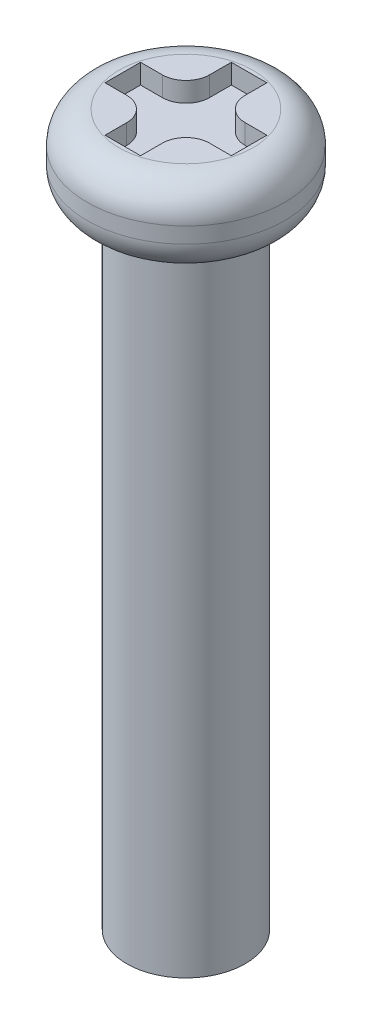
ISO-10303-21;
HEADER;
FILE_DESCRIPTION(('STEP AP214'),'2;1');
FILE_NAME('part.step','',(''),(''),'','','');
FILE_SCHEMA(('AUTOMOTIVE_DESIGN { 1 0 10303 214 1 1 1 1 }'));
ENDSEC;
DATA;
#1=APPLICATION_CONTEXT('core data for automotive mechanical design processes');
#2=APPLICATION_PROTOCOL_DEFINITION('international standard','automotive_design',2000,#1);
#3=PRODUCT_CONTEXT('',#1,'mechanical');
#4=PRODUCT('Part','Part','',(#3));
#5=PRODUCT_RELATED_PRODUCT_CATEGORY('part','',(#4));
#6=PRODUCT_DEFINITION_FORMATION('','',#4);
#7=PRODUCT_DEFINITION_CONTEXT('part definition',#1,'design');
#8=PRODUCT_DEFINITION('design','',#6,#7);
#9=PRODUCT_DEFINITION_SHAPE('','',#8);
#10=(LENGTH_UNIT() NAMED_UNIT(*) SI_UNIT(.MILLI.,.METRE.));
#11=(NAMED_UNIT(*) PLANE_ANGLE_UNIT() SI_UNIT($,.RADIAN.));
#12=(NAMED_UNIT(*) SI_UNIT($,.STERADIAN.) SOLID_ANGLE_UNIT());
#13=UNCERTAINTY_MEASURE_WITH_UNIT(LENGTH_MEASURE(1.E-05),#10,'distance_accuracy_value','');
#14=(GEOMETRIC_REPRESENTATION_CONTEXT(3) GLOBAL_UNCERTAINTY_ASSIGNED_CONTEXT((#13)) GLOBAL_UNIT_ASSIGNED_CONTEXT((#10,
#11,#12)) REPRESENTATION_CONTEXT('',''));
#15=CARTESIAN_POINT('',(0.,0.,0.));
#16=DIRECTION('',(0.,0.,1.));
#17=DIRECTION('',(1.,0.,0.));
#18=AXIS2_PLACEMENT_3D('',#15,#16,#17);
#19=CARTESIAN_POINT('',(0.,2.,0.));
#20=DIRECTION('',(0.,-1.,0.));
#21=DIRECTION('',(0.,0.,-1.));
#22=AXIS2_PLACEMENT_3D('',#19,#20,#21);
#23=PLANE('',#22);
#24=CARTESIAN_POINT('',(0.,2.,0.));
#25=DIRECTION('',(0.,-1.,0.));
#26=DIRECTION('',(0.,0.,-1.));
#27=AXIS2_PLACEMENT_3D('',#24,#25,#26);
#28=CIRCLE('',#27,1.7);
#29=CARTESIAN_POINT('',(0.,2.,-1.7));
#30=VERTEX_POINT('',#29);
#31=EDGE_CURVE('E251',#30,#30,#28,.F.);
#32=ORIENTED_EDGE('',*,*,#31,.T.);
#33=EDGE_LOOP('',(#32));
#34=FACE_BOUND('',#33,.T.);
#35=DIRECTION('',(1.,0.,0.));
#36=VECTOR('',#35,1.);
#37=CARTESIAN_POINT('',(-1.6,2.,0.450000000000001));
#38=LINE('',#37,#36);
#39=CARTESIAN_POINT('',(1.05,2.,0.450000000000001));
#40=VERTEX_POINT('',#39);
#41=CARTESIAN_POINT('',(1.6,2.,0.450000000000001));
#42=VERTEX_POINT('',#41);
#43=EDGE_CURVE('E180',#40,#42,#38,.T.);
#44=ORIENTED_EDGE('',*,*,#43,.F.);
#45=CARTESIAN_POINT('',(1.05,2.,1.05));
#46=DIRECTION('',(0.,-1.,0.));
#47=DIRECTION('',(0.,0.,-1.));
#48=AXIS2_PLACEMENT_3D('',#45,#46,#47);
#49=CIRCLE('',#48,0.6);
#50=CARTESIAN_POINT('',(0.45,2.,1.05));
#51=VERTEX_POINT('',#50);
#52=EDGE_CURVE('E262',#40,#51,#49,.F.);
#53=ORIENTED_EDGE('',*,*,#52,.T.);
#54=DIRECTION('',(0.,0.,-1.));
#55=VECTOR('',#54,1.);
#56=CARTESIAN_POINT('',(0.45,2.,1.6));
#57=LINE('',#56,#55);
#58=CARTESIAN_POINT('',(0.45,2.,1.6));
#59=VERTEX_POINT('',#58);
#60=EDGE_CURVE('E207',#59,#51,#57,.T.);
#61=ORIENTED_EDGE('',*,*,#60,.F.);
#62=DIRECTION('',(-1.,0.,0.));
#63=VECTOR('',#62,1.);
#64=CARTESIAN_POINT('',(0.45,2.,1.6));
#65=LINE('',#64,#63);
#66=CARTESIAN_POINT('',(-0.45,2.,1.6));
#67=VERTEX_POINT('',#66);
#68=EDGE_CURVE('E172',#59,#67,#65,.T.);
#69=ORIENTED_EDGE('',*,*,#68,.T.);
#70=DIRECTION('',(0.,0.,-1.));
#71=VECTOR('',#70,1.);
#72=CARTESIAN_POINT('',(-0.45,2.,1.6));
#73=LINE('',#72,#71);
#74=CARTESIAN_POINT('',(-0.45,2.,1.05));
#75=VERTEX_POINT('',#74);
#76=EDGE_CURVE('E222',#67,#75,#73,.T.);
#77=ORIENTED_EDGE('',*,*,#76,.T.);
#78=CARTESIAN_POINT('',(-1.05,2.,1.05));
#79=DIRECTION('',(0.,-1.,0.));
#80=DIRECTION('',(0.,0.,-1.));
#81=AXIS2_PLACEMENT_3D('',#78,#79,#80);
#82=CIRCLE('',#81,0.6);
#83=CARTESIAN_POINT('',(-1.05,2.,0.450000000000001));
#84=VERTEX_POINT('',#83);
#85=EDGE_CURVE('E260',#75,#84,#82,.F.);
#86=ORIENTED_EDGE('',*,*,#85,.T.);
#87=CARTESIAN_POINT('',(-1.6,2.,0.450000000000001));
#88=VERTEX_POINT('',#87);
#89=EDGE_CURVE('E184',#88,#84,#38,.T.);
#90=ORIENTED_EDGE('',*,*,#89,.F.);
#91=DIRECTION('',(0.,0.,1.));
#92=VECTOR('',#91,1.);
#93=CARTESIAN_POINT('',(-1.6,2.,0.450000000000001));
#94=LINE('',#93,#92);
#95=CARTESIAN_POINT('',(-1.6,2.,-0.449999999999999));
#96=VERTEX_POINT('',#95);
#97=EDGE_CURVE('E178',#96,#88,#94,.T.);
#98=ORIENTED_EDGE('',*,*,#97,.F.);
#99=DIRECTION('',(-1.,0.,0.));
#100=VECTOR('',#99,1.);
#101=CARTESIAN_POINT('',(-1.6,2.,-0.449999999999999));
#102=LINE('',#101,#100);
#103=CARTESIAN_POINT('',(-1.05,2.,-0.449999999999999));
#104=VERTEX_POINT('',#103);
#105=EDGE_CURVE('E161',#104,#96,#102,.T.);
#106=ORIENTED_EDGE('',*,*,#105,.F.);
#107=CARTESIAN_POINT('',(-1.05,2.,-1.05));
#108=DIRECTION('',(0.,-1.,0.));
#109=DIRECTION('',(0.,0.,-1.));
#110=AXIS2_PLACEMENT_3D('',#107,#108,#109);
#111=CIRCLE('',#110,0.6);
#112=CARTESIAN_POINT('',(-0.45,2.,-1.05));
#113=VERTEX_POINT('',#112);
#114=EDGE_CURVE('E257',#104,#113,#111,.F.);
#115=ORIENTED_EDGE('',*,*,#114,.T.);
#116=CARTESIAN_POINT('',(-0.45,2.,-1.6));
#117=VERTEX_POINT('',#116);
#118=EDGE_CURVE('E221',#113,#117,#73,.T.);
#119=ORIENTED_EDGE('',*,*,#118,.T.);
#120=DIRECTION('',(-1.,0.,0.));
#121=VECTOR('',#120,1.);
#122=CARTESIAN_POINT('',(0.45,2.,-1.6));
#123=LINE('',#122,#121);
#124=CARTESIAN_POINT('',(0.45,2.,-1.6));
#125=VERTEX_POINT('',#124);
#126=EDGE_CURVE('E225',#125,#117,#123,.T.);
#127=ORIENTED_EDGE('',*,*,#126,.F.);
#128=CARTESIAN_POINT('',(0.45,2.,-1.05));
#129=VERTEX_POINT('',#128);
#130=EDGE_CURVE('E228',#129,#125,#57,.T.);
#131=ORIENTED_EDGE('',*,*,#130,.F.);
#132=CARTESIAN_POINT('',(1.05,2.,-1.05));
#133=DIRECTION('',(0.,-1.,0.));
#134=DIRECTION('',(0.,0.,-1.));
#135=AXIS2_PLACEMENT_3D('',#132,#133,#134);
#136=CIRCLE('',#135,0.6);
#137=CARTESIAN_POINT('',(1.05,2.,-0.449999999999999));
#138=VERTEX_POINT('',#137);
#139=EDGE_CURVE('E177',#129,#138,#136,.F.);
#140=ORIENTED_EDGE('',*,*,#139,.T.);
#141=CARTESIAN_POINT('',(1.6,2.,-0.449999999999999));
#142=VERTEX_POINT('',#141);
#143=EDGE_CURVE('E168',#142,#138,#102,.T.);
#144=ORIENTED_EDGE('',*,*,#143,.F.);
#145=DIRECTION('',(0.,0.,-1.));
#146=VECTOR('',#145,1.);
#147=CARTESIAN_POINT('',(1.6,2.,0.450000000000001));
#148=LINE('',#147,#146);
#149=EDGE_CURVE('E150',#42,#142,#148,.T.);
#150=ORIENTED_EDGE('',*,*,#149,.F.);
#151=EDGE_LOOP('',(#44,#53,#61,#69,#77,#86,#90,#98,#106,#115,#119,#127,#131,#140,#144,#150));
#152=FACE_BOUND('',#151,.T.);
#153=ADVANCED_FACE('F38',(#34,#152),#23,.F.);
#154=CARTESIAN_POINT('',(-0.45,1.5,1.6));
#155=DIRECTION('',(1.,0.,0.));
#156=DIRECTION('',(0.,0.,-1.));
#157=AXIS2_PLACEMENT_3D('',#154,#155,#156);
#158=PLANE('',#157);
#159=ORIENTED_EDGE('',*,*,#118,.F.);
#160=DIRECTION('',(0.,-1.,0.));
#161=VECTOR('',#160,1.);
#162=CARTESIAN_POINT('',(-0.45,1.5,-1.05));
#163=LINE('',#162,#161);
#164=CARTESIAN_POINT('',(-0.45,1.5,-1.05));
#165=VERTEX_POINT('',#164);
#166=EDGE_CURVE('E275',#113,#165,#163,.T.);
#167=ORIENTED_EDGE('',*,*,#166,.T.);
#168=DIRECTION('',(0.,0.,-1.));
#169=VECTOR('',#168,1.);
#170=CARTESIAN_POINT('',(-0.45,1.5,1.6));
#171=LINE('',#170,#169);
#172=CARTESIAN_POINT('',(-0.45,1.5,-1.6));
#173=VERTEX_POINT('',#172);
#174=EDGE_CURVE('E206',#165,#173,#171,.T.);
#175=ORIENTED_EDGE('',*,*,#174,.T.);
#176=DIRECTION('',(0.,1.,0.));
#177=VECTOR('',#176,1.);
#178=CARTESIAN_POINT('',(-0.45,1.5,-1.6));
#179=LINE('',#178,#177);
#180=EDGE_CURVE('E236',#173,#117,#179,.T.);
#181=ORIENTED_EDGE('',*,*,#180,.T.);
#182=EDGE_LOOP('',(#159,#167,#175,#181));
#183=FACE_BOUND('',#182,.T.);
#184=ADVANCED_FACE('F302',(#183),#158,.T.);
#185=CARTESIAN_POINT('',(-0.45,1.5,1.6));
#186=VERTEX_POINT('',#185);
#187=CARTESIAN_POINT('',(-0.45,1.5,1.05));
#188=VERTEX_POINT('',#187);
#189=EDGE_CURVE('E208',#186,#188,#171,.T.);
#190=ORIENTED_EDGE('',*,*,#189,.T.);
#191=DIRECTION('',(0.,1.,0.));
#192=VECTOR('',#191,1.);
#193=CARTESIAN_POINT('',(-0.45,1.5,1.05));
#194=LINE('',#193,#192);
#195=EDGE_CURVE('E266',#188,#75,#194,.T.);
#196=ORIENTED_EDGE('',*,*,#195,.T.);
#197=ORIENTED_EDGE('',*,*,#76,.F.);
#198=DIRECTION('',(0.,1.,0.));
#199=VECTOR('',#198,1.);
#200=CARTESIAN_POINT('',(-0.45,1.5,1.6));
#201=LINE('',#200,#199);
#202=EDGE_CURVE('E239',#186,#67,#201,.T.);
#203=ORIENTED_EDGE('',*,*,#202,.F.);
#204=EDGE_LOOP('',(#190,#196,#197,#203));
#205=FACE_BOUND('',#204,.T.);
#206=ADVANCED_FACE('F308',(#205),#158,.T.);
#207=CARTESIAN_POINT('',(0.45,1.5,1.6));
#208=DIRECTION('',(1.,0.,0.));
#209=DIRECTION('',(0.,0.,-1.));
#210=AXIS2_PLACEMENT_3D('',#207,#208,#209);
#211=PLANE('',#210);
#212=DIRECTION('',(0.,0.,-1.));
#213=VECTOR('',#212,1.);
#214=CARTESIAN_POINT('',(0.45,1.5,1.6));
#215=LINE('',#214,#213);
#216=CARTESIAN_POINT('',(0.45,1.5,-1.05));
#217=VERTEX_POINT('',#216);
#218=CARTESIAN_POINT('',(0.45,1.5,-1.6));
#219=VERTEX_POINT('',#218);
#220=EDGE_CURVE('E214',#217,#219,#215,.T.);
#221=ORIENTED_EDGE('',*,*,#220,.F.);
#222=DIRECTION('',(0.,-1.,0.));
#223=VECTOR('',#222,1.);
#224=CARTESIAN_POINT('',(0.45,2.,-1.05));
#225=LINE('',#224,#223);
#226=EDGE_CURVE('E273',#217,#129,#225,.F.);
#227=ORIENTED_EDGE('',*,*,#226,.T.);
#228=ORIENTED_EDGE('',*,*,#130,.T.);
#229=DIRECTION('',(0.,1.,0.));
#230=VECTOR('',#229,1.);
#231=CARTESIAN_POINT('',(0.45,1.5,-1.6));
#232=LINE('',#231,#230);
#233=EDGE_CURVE('E233',#219,#125,#232,.T.);
#234=ORIENTED_EDGE('',*,*,#233,.F.);
#235=EDGE_LOOP('',(#221,#227,#228,#234));
#236=FACE_BOUND('',#235,.T.);
#237=ADVANCED_FACE('F288',(#236),#211,.F.);
#238=ORIENTED_EDGE('',*,*,#60,.T.);
#239=DIRECTION('',(0.,1.,0.));
#240=VECTOR('',#239,1.);
#241=CARTESIAN_POINT('',(0.45,1.5,1.05));
#242=LINE('',#241,#240);
#243=CARTESIAN_POINT('',(0.45,1.5,1.05));
#244=VERTEX_POINT('',#243);
#245=EDGE_CURVE('E264',#51,#244,#242,.F.);
#246=ORIENTED_EDGE('',*,*,#245,.T.);
#247=CARTESIAN_POINT('',(0.45,1.5,1.6));
#248=VERTEX_POINT('',#247);
#249=EDGE_CURVE('E215',#248,#244,#215,.T.);
#250=ORIENTED_EDGE('',*,*,#249,.F.);
#251=DIRECTION('',(0.,1.,0.));
#252=VECTOR('',#251,1.);
#253=CARTESIAN_POINT('',(0.45,1.5,1.6));
#254=LINE('',#253,#252);
#255=EDGE_CURVE('E218',#248,#59,#254,.T.);
#256=ORIENTED_EDGE('',*,*,#255,.T.);
#257=EDGE_LOOP('',(#238,#246,#250,#256));
#258=FACE_BOUND('',#257,.T.);
#259=ADVANCED_FACE('F322',(#258),#211,.F.);
#260=CARTESIAN_POINT('',(0.,0.,0.));
#261=DIRECTION('',(0.,-1.,0.));
#262=DIRECTION('',(0.,0.,-1.));
#263=AXIS2_PLACEMENT_3D('',#260,#261,#262);
#264=PLANE('',#263);
#265=CARTESIAN_POINT('',(0.,0.,0.));
#266=DIRECTION('',(0.,-1.,0.));
#267=DIRECTION('',(0.,0.,-1.));
#268=AXIS2_PLACEMENT_3D('',#265,#266,#267);
#269=CIRCLE('',#268,1.5);
#270=CARTESIAN_POINT('',(0.,0.,-1.5));
#271=VERTEX_POINT('',#270);
#272=EDGE_CURVE('E398',#271,#271,#269,.T.);
#273=ORIENTED_EDGE('',*,*,#272,.F.);
#274=EDGE_LOOP('',(#273));
#275=FACE_BOUND('',#274,.T.);
#276=CARTESIAN_POINT('',(0.,0.,0.));
#277=DIRECTION('',(0.,-1.,0.));
#278=DIRECTION('',(0.,0.,-1.));
#279=AXIS2_PLACEMENT_3D('',#276,#277,#278);
#280=CIRCLE('',#279,1.7);
#281=CARTESIAN_POINT('',(0.,0.,-1.7));
#282=VERTEX_POINT('',#281);
#283=EDGE_CURVE('E242',#282,#282,#280,.T.);
#284=ORIENTED_EDGE('',*,*,#283,.T.);
#285=EDGE_LOOP('',(#284));
#286=FACE_BOUND('',#285,.T.);
#287=ADVANCED_FACE('F318',(#275,#286),#264,.T.);
#288=CARTESIAN_POINT('',(0.,0.,0.));
#289=DIRECTION('',(0.,-1.,0.));
#290=DIRECTION('',(0.,0.,-1.));
#291=AXIS2_PLACEMENT_3D('',#288,#289,#290);
#292=CYLINDRICAL_SURFACE('',#291,2.5);
#293=CARTESIAN_POINT('',(0.,0.8,0.));
#294=DIRECTION('',(0.,-1.,0.));
#295=DIRECTION('',(0.,0.,-1.));
#296=AXIS2_PLACEMENT_3D('',#293,#294,#295);
#297=CIRCLE('',#296,2.5);
#298=CARTESIAN_POINT('',(0.,0.8,-2.5));
#299=VERTEX_POINT('',#298);
#300=EDGE_CURVE('E248',#299,#299,#297,.F.);
#301=ORIENTED_EDGE('',*,*,#300,.T.);
#302=EDGE_LOOP('',(#301));
#303=FACE_BOUND('',#302,.T.);
#304=CARTESIAN_POINT('',(0.,1.2,0.));
#305=DIRECTION('',(0.,-1.,0.));
#306=DIRECTION('',(0.,0.,-1.));
#307=AXIS2_PLACEMENT_3D('',#304,#305,#306);
#308=CIRCLE('',#307,2.5);
#309=CARTESIAN_POINT('',(0.,1.2,-2.5));
#310=VERTEX_POINT('',#309);
#311=EDGE_CURVE('E245',#310,#310,#308,.T.);
#312=ORIENTED_EDGE('',*,*,#311,.T.);
#313=EDGE_LOOP('',(#312));
#314=FACE_BOUND('',#313,.T.);
#315=ADVANCED_FACE('F314',(#303,#314),#292,.T.);
#316=CARTESIAN_POINT('',(0.,0.8,0.));
#317=DIRECTION('',(0.,-1.,0.));
#318=DIRECTION('',(0.,0.,-1.));
#319=AXIS2_PLACEMENT_3D('',#316,#317,#318);
#320=TOROIDAL_SURFACE('',#319,1.7,0.8);
#321=ORIENTED_EDGE('',*,*,#300,.F.);
#322=EDGE_LOOP('',(#321));
#323=FACE_BOUND('',#322,.T.);
#324=ORIENTED_EDGE('',*,*,#283,.F.);
#325=EDGE_LOOP('',(#324));
#326=FACE_BOUND('',#325,.T.);
#327=ADVANCED_FACE('F317',(#323,#326),#320,.T.);
#328=CARTESIAN_POINT('',(0.,1.2,0.));
#329=DIRECTION('',(0.,-1.,0.));
#330=DIRECTION('',(0.,0.,-1.));
#331=AXIS2_PLACEMENT_3D('',#328,#329,#330);
#332=TOROIDAL_SURFACE('',#331,1.7,0.8);
#333=ORIENTED_EDGE('',*,*,#31,.F.);
#334=EDGE_LOOP('',(#333));
#335=FACE_BOUND('',#334,.T.);
#336=ORIENTED_EDGE('',*,*,#311,.F.);
#337=EDGE_LOOP('',(#336));
#338=FACE_BOUND('',#337,.T.);
#339=ADVANCED_FACE('F326',(#335,#338),#332,.T.);
#340=CARTESIAN_POINT('',(0.45,1.5,1.6));
#341=DIRECTION('',(0.,0.,-1.));
#342=DIRECTION('',(-1.,0.,0.));
#343=AXIS2_PLACEMENT_3D('',#340,#341,#342);
#344=PLANE('',#343);
#345=ORIENTED_EDGE('',*,*,#68,.F.);
#346=ORIENTED_EDGE('',*,*,#255,.F.);
#347=DIRECTION('',(-1.,0.,0.));
#348=VECTOR('',#347,1.);
#349=CARTESIAN_POINT('',(0.45,1.5,1.6));
#350=LINE('',#349,#348);
#351=EDGE_CURVE('E203',#248,#186,#350,.T.);
#352=ORIENTED_EDGE('',*,*,#351,.T.);
#353=ORIENTED_EDGE('',*,*,#202,.T.);
#354=EDGE_LOOP('',(#345,#346,#352,#353));
#355=FACE_BOUND('',#354,.T.);
#356=ADVANCED_FACE('F313',(#355),#344,.T.);
#357=CARTESIAN_POINT('',(0.45,1.5,-1.6));
#358=DIRECTION('',(0.,0.,-1.));
#359=DIRECTION('',(0.,1.,0.));
#360=AXIS2_PLACEMENT_3D('',#357,#358,#359);
#361=PLANE('',#360);
#362=ORIENTED_EDGE('',*,*,#126,.T.);
#363=ORIENTED_EDGE('',*,*,#180,.F.);
#364=DIRECTION('',(-1.,0.,0.));
#365=VECTOR('',#364,1.);
#366=CARTESIAN_POINT('',(0.45,1.5,-1.6));
#367=LINE('',#366,#365);
#368=EDGE_CURVE('E211',#219,#173,#367,.T.);
#369=ORIENTED_EDGE('',*,*,#368,.F.);
#370=ORIENTED_EDGE('',*,*,#233,.T.);
#371=EDGE_LOOP('',(#362,#363,#369,#370));
#372=FACE_BOUND('',#371,.T.);
#373=ADVANCED_FACE('F369',(#372),#361,.F.);
#374=CARTESIAN_POINT('',(0.,1.5,0.));
#375=DIRECTION('',(0.,-1.,0.));
#376=DIRECTION('',(0.,0.,-1.));
#377=AXIS2_PLACEMENT_3D('',#374,#375,#376);
#378=PLANE('',#377);
#379=ORIENTED_EDGE('',*,*,#249,.T.);
#380=CARTESIAN_POINT('',(1.05,1.5,1.05));
#381=DIRECTION('',(0.,-1.,0.));
#382=DIRECTION('',(0.,0.,-1.));
#383=AXIS2_PLACEMENT_3D('',#380,#381,#382);
#384=CIRCLE('',#383,0.6);
#385=CARTESIAN_POINT('',(1.05,1.5,0.450000000000001));
#386=VERTEX_POINT('',#385);
#387=EDGE_CURVE('E279',#244,#386,#384,.T.);
#388=ORIENTED_EDGE('',*,*,#387,.T.);
#389=DIRECTION('',(1.,0.,0.));
#390=VECTOR('',#389,1.);
#391=CARTESIAN_POINT('',(-1.6,1.5,0.450000000000001));
#392=LINE('',#391,#390);
#393=CARTESIAN_POINT('',(1.6,1.5,0.450000000000001));
#394=VERTEX_POINT('',#393);
#395=EDGE_CURVE('E194',#386,#394,#392,.T.);
#396=ORIENTED_EDGE('',*,*,#395,.T.);
#397=DIRECTION('',(0.,0.,-1.));
#398=VECTOR('',#397,1.);
#399=CARTESIAN_POINT('',(1.6,1.5,0.450000000000001));
#400=LINE('',#399,#398);
#401=CARTESIAN_POINT('',(1.6,1.5,-0.449999999999999));
#402=VERTEX_POINT('',#401);
#403=EDGE_CURVE('E187',#394,#402,#400,.T.);
#404=ORIENTED_EDGE('',*,*,#403,.T.);
#405=DIRECTION('',(-1.,0.,0.));
#406=VECTOR('',#405,1.);
#407=CARTESIAN_POINT('',(-1.6,1.5,-0.449999999999999));
#408=LINE('',#407,#406);
#409=CARTESIAN_POINT('',(1.05,1.5,-0.449999999999999));
#410=VERTEX_POINT('',#409);
#411=EDGE_CURVE('E171',#402,#410,#408,.T.);
#412=ORIENTED_EDGE('',*,*,#411,.T.);
#413=CARTESIAN_POINT('',(1.05,1.5,-1.05));
#414=DIRECTION('',(0.,-1.,0.));
#415=DIRECTION('',(0.,0.,-1.));
#416=AXIS2_PLACEMENT_3D('',#413,#414,#415);
#417=CIRCLE('',#416,0.6);
#418=EDGE_CURVE('E46',#410,#217,#417,.T.);
#419=ORIENTED_EDGE('',*,*,#418,.T.);
#420=ORIENTED_EDGE('',*,*,#220,.T.);
#421=ORIENTED_EDGE('',*,*,#368,.T.);
#422=ORIENTED_EDGE('',*,*,#174,.F.);
#423=CARTESIAN_POINT('',(-1.05,1.5,-1.05));
#424=DIRECTION('',(0.,-1.,0.));
#425=DIRECTION('',(0.,0.,-1.));
#426=AXIS2_PLACEMENT_3D('',#423,#424,#425);
#427=CIRCLE('',#426,0.6);
#428=CARTESIAN_POINT('',(-1.05,1.5,-0.449999999999999));
#429=VERTEX_POINT('',#428);
#430=EDGE_CURVE('E11',#165,#429,#427,.T.);
#431=ORIENTED_EDGE('',*,*,#430,.T.);
#432=CARTESIAN_POINT('',(-1.6,1.5,-0.449999999999999));
#433=VERTEX_POINT('',#432);
#434=EDGE_CURVE('E189',#429,#433,#408,.T.);
#435=ORIENTED_EDGE('',*,*,#434,.T.);
#436=DIRECTION('',(0.,0.,1.));
#437=VECTOR('',#436,1.);
#438=CARTESIAN_POINT('',(-1.6,1.5,0.450000000000001));
#439=LINE('',#438,#437);
#440=CARTESIAN_POINT('',(-1.6,1.5,0.450000000000001));
#441=VERTEX_POINT('',#440);
#442=EDGE_CURVE('E192',#433,#441,#439,.T.);
#443=ORIENTED_EDGE('',*,*,#442,.T.);
#444=CARTESIAN_POINT('',(-1.05,1.5,0.450000000000001));
#445=VERTEX_POINT('',#444);
#446=EDGE_CURVE('E162',#441,#445,#392,.T.);
#447=ORIENTED_EDGE('',*,*,#446,.T.);
#448=CARTESIAN_POINT('',(-1.05,1.5,1.05));
#449=DIRECTION('',(0.,-1.,0.));
#450=DIRECTION('',(0.,0.,-1.));
#451=AXIS2_PLACEMENT_3D('',#448,#449,#450);
#452=CIRCLE('',#451,0.6);
#453=EDGE_CURVE('E281',#445,#188,#452,.T.);
#454=ORIENTED_EDGE('',*,*,#453,.T.);
#455=ORIENTED_EDGE('',*,*,#189,.F.);
#456=ORIENTED_EDGE('',*,*,#351,.F.);
#457=EDGE_LOOP('',(#379,#388,#396,#404,#412,#419,#420,#421,#422,#431,#435,#443,#447,#454,#455,#456));
#458=FACE_BOUND('',#457,.T.);
#459=ADVANCED_FACE('F283',(#458),#378,.F.);
#460=CARTESIAN_POINT('',(-1.6,2.,0.450000000000001));
#461=DIRECTION('',(0.,0.,-1.));
#462=DIRECTION('',(0.,1.,0.));
#463=AXIS2_PLACEMENT_3D('',#460,#461,#462);
#464=PLANE('',#463);
#465=ORIENTED_EDGE('',*,*,#395,.F.);
#466=DIRECTION('',(0.,1.,0.));
#467=VECTOR('',#466,1.);
#468=CARTESIAN_POINT('',(1.05,2.,0.450000000000001));
#469=LINE('',#468,#467);
#470=EDGE_CURVE('E254',#386,#40,#469,.T.);
#471=ORIENTED_EDGE('',*,*,#470,.T.);
#472=ORIENTED_EDGE('',*,*,#43,.T.);
#473=DIRECTION('',(0.,-1.,0.));
#474=VECTOR('',#473,1.);
#475=CARTESIAN_POINT('',(1.6,2.,0.450000000000001));
#476=LINE('',#475,#474);
#477=EDGE_CURVE('E157',#42,#394,#476,.T.);
#478=ORIENTED_EDGE('',*,*,#477,.T.);
#479=EDGE_LOOP('',(#465,#471,#472,#478));
#480=FACE_BOUND('',#479,.T.);
#481=ADVANCED_FACE('F340',(#480),#464,.T.);
#482=CARTESIAN_POINT('',(-1.6,2.,-0.449999999999999));
#483=DIRECTION('',(0.,0.,1.));
#484=DIRECTION('',(0.,-1.,0.));
#485=AXIS2_PLACEMENT_3D('',#482,#483,#484);
#486=PLANE('',#485);
#487=ORIENTED_EDGE('',*,*,#143,.T.);
#488=DIRECTION('',(0.,-1.,0.));
#489=VECTOR('',#488,1.);
#490=CARTESIAN_POINT('',(1.05,1.5,-0.449999999999999));
#491=LINE('',#490,#489);
#492=EDGE_CURVE('E271',#138,#410,#491,.T.);
#493=ORIENTED_EDGE('',*,*,#492,.T.);
#494=ORIENTED_EDGE('',*,*,#411,.F.);
#495=DIRECTION('',(0.,-1.,0.));
#496=VECTOR('',#495,1.);
#497=CARTESIAN_POINT('',(1.6,2.,-0.449999999999999));
#498=LINE('',#497,#496);
#499=EDGE_CURVE('E154',#142,#402,#498,.T.);
#500=ORIENTED_EDGE('',*,*,#499,.F.);
#501=EDGE_LOOP('',(#487,#493,#494,#500));
#502=FACE_BOUND('',#501,.T.);
#503=ADVANCED_FACE('F166',(#502),#486,.T.);
#504=CARTESIAN_POINT('',(1.6,2.,0.450000000000001));
#505=DIRECTION('',(-1.,0.,0.));
#506=DIRECTION('',(0.,0.,1.));
#507=AXIS2_PLACEMENT_3D('',#504,#505,#506);
#508=PLANE('',#507);
#509=ORIENTED_EDGE('',*,*,#403,.F.);
#510=ORIENTED_EDGE('',*,*,#477,.F.);
#511=ORIENTED_EDGE('',*,*,#149,.T.);
#512=ORIENTED_EDGE('',*,*,#499,.T.);
#513=EDGE_LOOP('',(#509,#510,#511,#512));
#514=FACE_BOUND('',#513,.T.);
#515=ADVANCED_FACE('F153',(#514),#508,.T.);
#516=ORIENTED_EDGE('',*,*,#434,.F.);
#517=DIRECTION('',(0.,-1.,0.));
#518=VECTOR('',#517,1.);
#519=CARTESIAN_POINT('',(-1.05,2.,-0.449999999999999));
#520=LINE('',#519,#518);
#521=EDGE_CURVE('E277',#429,#104,#520,.F.);
#522=ORIENTED_EDGE('',*,*,#521,.T.);
#523=ORIENTED_EDGE('',*,*,#105,.T.);
#524=DIRECTION('',(0.,-1.,0.));
#525=VECTOR('',#524,1.);
#526=CARTESIAN_POINT('',(-1.6,2.,-0.449999999999999));
#527=LINE('',#526,#525);
#528=EDGE_CURVE('E173',#96,#433,#527,.T.);
#529=ORIENTED_EDGE('',*,*,#528,.T.);
#530=EDGE_LOOP('',(#516,#522,#523,#529));
#531=FACE_BOUND('',#530,.T.);
#532=ADVANCED_FACE('F383',(#531),#486,.T.);
#533=CARTESIAN_POINT('',(-1.6,2.,0.450000000000001));
#534=DIRECTION('',(1.,0.,0.));
#535=DIRECTION('',(0.,0.,-1.));
#536=AXIS2_PLACEMENT_3D('',#533,#534,#535);
#537=PLANE('',#536);
#538=ORIENTED_EDGE('',*,*,#442,.F.);
#539=ORIENTED_EDGE('',*,*,#528,.F.);
#540=ORIENTED_EDGE('',*,*,#97,.T.);
#541=DIRECTION('',(0.,-1.,0.));
#542=VECTOR('',#541,1.);
#543=CARTESIAN_POINT('',(-1.6,2.,0.450000000000001));
#544=LINE('',#543,#542);
#545=EDGE_CURVE('E198',#88,#441,#544,.T.);
#546=ORIENTED_EDGE('',*,*,#545,.T.);
#547=EDGE_LOOP('',(#538,#539,#540,#546));
#548=FACE_BOUND('',#547,.T.);
#549=ADVANCED_FACE('F337',(#548),#537,.T.);
#550=ORIENTED_EDGE('',*,*,#89,.T.);
#551=DIRECTION('',(0.,1.,0.));
#552=VECTOR('',#551,1.);
#553=CARTESIAN_POINT('',(-1.05,2.,0.450000000000001));
#554=LINE('',#553,#552);
#555=EDGE_CURVE('E269',#84,#445,#554,.F.);
#556=ORIENTED_EDGE('',*,*,#555,.T.);
#557=ORIENTED_EDGE('',*,*,#446,.F.);
#558=ORIENTED_EDGE('',*,*,#545,.F.);
#559=EDGE_LOOP('',(#550,#556,#557,#558));
#560=FACE_BOUND('',#559,.T.);
#561=ADVANCED_FACE('F332',(#560),#464,.T.);
#562=CARTESIAN_POINT('',(1.05,2.,1.05));
#563=DIRECTION('',(0.,-1.,0.));
#564=DIRECTION('',(0.,0.,-1.));
#565=AXIS2_PLACEMENT_3D('',#562,#563,#564);
#566=CYLINDRICAL_SURFACE('',#565,0.6);
#567=ORIENTED_EDGE('',*,*,#387,.F.);
#568=ORIENTED_EDGE('',*,*,#245,.F.);
#569=ORIENTED_EDGE('',*,*,#52,.F.);
#570=ORIENTED_EDGE('',*,*,#470,.F.);
#571=EDGE_LOOP('',(#567,#568,#569,#570));
#572=FACE_BOUND('',#571,.T.);
#573=ADVANCED_FACE('F298',(#572),#566,.T.);
#574=CARTESIAN_POINT('',(-1.05,1.5,1.05));
#575=DIRECTION('',(0.,1.,0.));
#576=DIRECTION('',(0.,0.,1.));
#577=AXIS2_PLACEMENT_3D('',#574,#575,#576);
#578=CYLINDRICAL_SURFACE('',#577,0.6);
#579=ORIENTED_EDGE('',*,*,#453,.F.);
#580=ORIENTED_EDGE('',*,*,#555,.F.);
#581=ORIENTED_EDGE('',*,*,#85,.F.);
#582=ORIENTED_EDGE('',*,*,#195,.F.);
#583=EDGE_LOOP('',(#579,#580,#581,#582));
#584=FACE_BOUND('',#583,.T.);
#585=ADVANCED_FACE('F292',(#584),#578,.T.);
#586=CARTESIAN_POINT('',(1.05,2.,-1.05));
#587=DIRECTION('',(0.,1.,0.));
#588=DIRECTION('',(0.,0.,1.));
#589=AXIS2_PLACEMENT_3D('',#586,#587,#588);
#590=CYLINDRICAL_SURFACE('',#589,0.6);
#591=ORIENTED_EDGE('',*,*,#139,.F.);
#592=ORIENTED_EDGE('',*,*,#226,.F.);
#593=ORIENTED_EDGE('',*,*,#418,.F.);
#594=ORIENTED_EDGE('',*,*,#492,.F.);
#595=EDGE_LOOP('',(#591,#592,#593,#594));
#596=FACE_BOUND('',#595,.T.);
#597=ADVANCED_FACE('F290',(#596),#590,.T.);
#598=CARTESIAN_POINT('',(-1.05,1.5,-1.05));
#599=DIRECTION('',(0.,-1.,0.));
#600=DIRECTION('',(0.,0.,-1.));
#601=AXIS2_PLACEMENT_3D('',#598,#599,#600);
#602=CYLINDRICAL_SURFACE('',#601,0.6);
#603=ORIENTED_EDGE('',*,*,#114,.F.);
#604=ORIENTED_EDGE('',*,*,#521,.F.);
#605=ORIENTED_EDGE('',*,*,#430,.F.);
#606=ORIENTED_EDGE('',*,*,#166,.F.);
#607=EDGE_LOOP('',(#603,#604,#605,#606));
#608=FACE_BOUND('',#607,.T.);
#609=ADVANCED_FACE('F40',(#608),#602,.T.);
#610=CARTESIAN_POINT('',(0.,-16.,0.));
#611=DIRECTION('',(0.,1.,0.));
#612=DIRECTION('',(0.,0.,1.));
#613=AXIS2_PLACEMENT_3D('',#610,#611,#612);
#614=CYLINDRICAL_SURFACE('',#613,1.5);
#615=CARTESIAN_POINT('',(0.,-16.,0.));
#616=DIRECTION('',(0.,-1.,0.));
#617=DIRECTION('',(0.,0.,-1.));
#618=AXIS2_PLACEMENT_3D('',#615,#616,#617);
#619=CIRCLE('',#618,1.5);
#620=CARTESIAN_POINT('',(0.,-16.,-1.5));
#621=VERTEX_POINT('',#620);
#622=EDGE_CURVE('E190',#621,#621,#619,.T.);
#623=ORIENTED_EDGE('',*,*,#622,.F.);
#624=EDGE_LOOP('',(#623));
#625=FACE_BOUND('',#624,.T.);
#626=ORIENTED_EDGE('',*,*,#272,.T.);
#627=EDGE_LOOP('',(#626));
#628=FACE_BOUND('',#627,.T.);
#629=ADVANCED_FACE('F297',(#625,#628),#614,.T.);
#630=CARTESIAN_POINT('',(0.,-16.,0.));
#631=DIRECTION('',(0.,-1.,0.));
#632=DIRECTION('',(0.,0.,-1.));
#633=AXIS2_PLACEMENT_3D('',#630,#631,#632);
#634=PLANE('',#633);
#635=ORIENTED_EDGE('',*,*,#622,.T.);
#636=EDGE_LOOP('',(#635));
#637=FACE_BOUND('',#636,.T.);
#638=ADVANCED_FACE('F390',(#637),#634,.T.);
#639=CLOSED_SHELL('',(#153,#184,#206,#237,#259,#287,#315,#327,#339,#356,#373,#459,#481,#503,
#515,#532,#549,#561,#573,#585,#597,#609,#629,#638));
#640=MANIFOLD_SOLID_BREP('B2',#639);
#641=ADVANCED_BREP_SHAPE_REPRESENTATION('',(#18,#640),#14);
#642=SHAPE_DEFINITION_REPRESENTATION(#9,#641);
ENDSEC;
END-ISO-10303-21;
